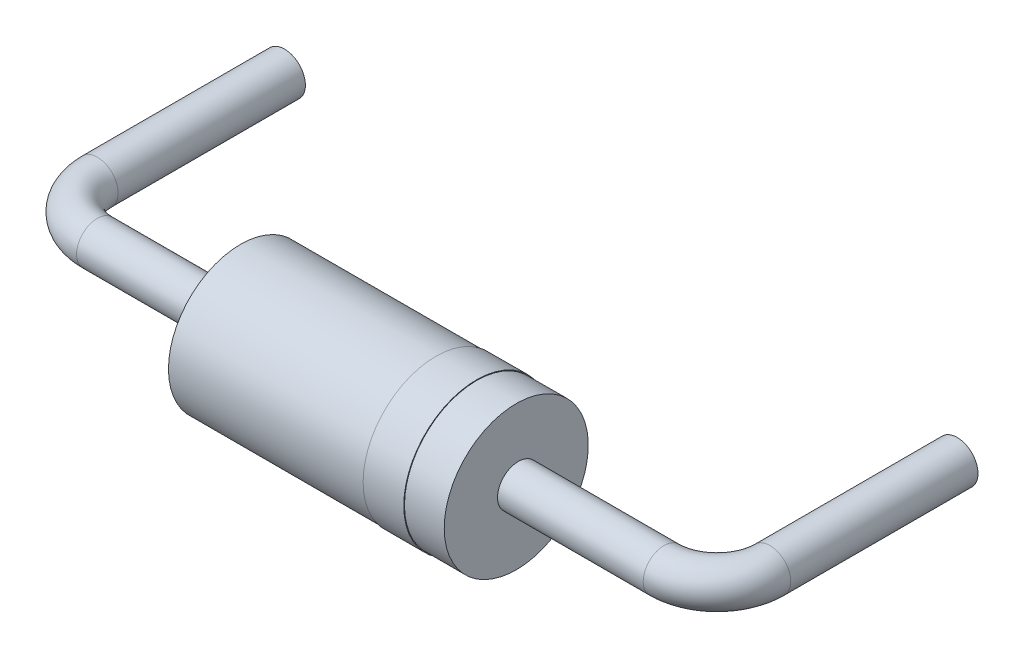
ISO-10303-21;
HEADER;
FILE_DESCRIPTION(('STEP AP214'),'2;1');
FILE_NAME('part.step','',(''),(''),'','','');
FILE_SCHEMA(('AUTOMOTIVE_DESIGN { 1 0 10303 214 1 1 1 1 }'));
ENDSEC;
DATA;
#1=APPLICATION_CONTEXT('core data for automotive mechanical design processes');
#2=APPLICATION_PROTOCOL_DEFINITION('international standard','automotive_design',2000,#1);
#3=PRODUCT_CONTEXT('',#1,'mechanical');
#4=PRODUCT('Part','Part','',(#3));
#5=PRODUCT_RELATED_PRODUCT_CATEGORY('part','',(#4));
#6=PRODUCT_DEFINITION_FORMATION('','',#4);
#7=PRODUCT_DEFINITION_CONTEXT('part definition',#1,'design');
#8=PRODUCT_DEFINITION('design','',#6,#7);
#9=PRODUCT_DEFINITION_SHAPE('','',#8);
#10=(LENGTH_UNIT() NAMED_UNIT(*) SI_UNIT(.MILLI.,.METRE.));
#11=(NAMED_UNIT(*) PLANE_ANGLE_UNIT() SI_UNIT($,.RADIAN.));
#12=(NAMED_UNIT(*) SI_UNIT($,.STERADIAN.) SOLID_ANGLE_UNIT());
#13=UNCERTAINTY_MEASURE_WITH_UNIT(LENGTH_MEASURE(1.E-05),#10,'distance_accuracy_value','');
#14=(GEOMETRIC_REPRESENTATION_CONTEXT(3) GLOBAL_UNCERTAINTY_ASSIGNED_CONTEXT((#13)) GLOBAL_UNIT_ASSIGNED_CONTEXT((#10,
#11,#12)) REPRESENTATION_CONTEXT('',''));
#15=CARTESIAN_POINT('',(0.,0.,0.));
#16=DIRECTION('',(0.,0.,1.));
#17=DIRECTION('',(1.,0.,0.));
#18=AXIS2_PLACEMENT_3D('',#15,#16,#17);
#19=CARTESIAN_POINT('',(46.2577130474384,27.99199126,0.3727));
#20=DIRECTION('',(0.,-1.,0.));
#21=DIRECTION('',(0.,0.,1.));
#22=AXIS2_PLACEMENT_3D('',#19,#20,#21);
#23=TOROIDAL_SURFACE('',#22,1.,0.3935);
#24=CARTESIAN_POINT('',(47.2577130474384,27.99199126,0.3727));
#25=DIRECTION('',(0.,0.,-1.));
#26=DIRECTION('',(1.,0.,0.));
#27=AXIS2_PLACEMENT_3D('',#24,#25,#26);
#28=CIRCLE('',#27,0.3935);
#29=CARTESIAN_POINT('',(46.8642130474384,27.99199126,0.3727));
#30=VERTEX_POINT('',#29);
#31=EDGE_CURVE('E40',#30,#30,#28,.T.);
#32=ORIENTED_EDGE('',*,*,#31,.F.);
#33=EDGE_LOOP('',(#32));
#34=FACE_BOUND('',#33,.T.);
#35=CARTESIAN_POINT('',(46.2577130474384,27.99199126,1.3727));
#36=DIRECTION('',(1.,0.,0.));
#37=DIRECTION('',(0.,0.,1.));
#38=AXIS2_PLACEMENT_3D('',#35,#36,#37);
#39=CIRCLE('',#38,0.3935);
#40=CARTESIAN_POINT('',(46.2577130474384,27.99199126,0.9792));
#41=VERTEX_POINT('',#40);
#42=EDGE_CURVE('E11',#41,#41,#39,.T.);
#43=ORIENTED_EDGE('',*,*,#42,.T.);
#44=EDGE_LOOP('',(#43));
#45=FACE_BOUND('',#44,.T.);
#46=ADVANCED_FACE('F16',(#34,#45),#23,.T.);
#47=CARTESIAN_POINT('',(35.5577130474384,27.99199126,0.3727));
#48=DIRECTION('',(0.,1.,0.));
#49=DIRECTION('',(0.,0.,-1.));
#50=AXIS2_PLACEMENT_3D('',#47,#48,#49);
#51=TOROIDAL_SURFACE('',#50,1.,0.3935);
#52=CARTESIAN_POINT('',(34.5577130474384,27.99199126,0.3727));
#53=DIRECTION('',(0.,0.,-1.));
#54=DIRECTION('',(1.,0.,0.));
#55=AXIS2_PLACEMENT_3D('',#52,#53,#54);
#56=CIRCLE('',#55,0.3935);
#57=CARTESIAN_POINT('',(34.9512130474384,27.99199126,0.3727));
#58=VERTEX_POINT('',#57);
#59=EDGE_CURVE('E106',#58,#58,#56,.T.);
#60=ORIENTED_EDGE('',*,*,#59,.F.);
#61=EDGE_LOOP('',(#60));
#62=FACE_BOUND('',#61,.T.);
#63=CARTESIAN_POINT('',(35.5577130474384,27.99199126,1.3727));
#64=DIRECTION('',(-1.,0.,0.));
#65=DIRECTION('',(0.,0.,-1.));
#66=AXIS2_PLACEMENT_3D('',#63,#64,#65);
#67=CIRCLE('',#66,0.3935);
#68=CARTESIAN_POINT('',(35.5577130474384,27.99199126,0.9792));
#69=VERTEX_POINT('',#68);
#70=EDGE_CURVE('E27',#69,#69,#67,.T.);
#71=ORIENTED_EDGE('',*,*,#70,.T.);
#72=EDGE_LOOP('',(#71));
#73=FACE_BOUND('',#72,.T.);
#74=ADVANCED_FACE('F174',(#62,#73),#51,.T.);
#75=CARTESIAN_POINT('',(34.5577130474384,27.99199126,0.0127000000000011));
#76=DIRECTION('',(0.,0.,-1.));
#77=DIRECTION('',(1.,0.,0.));
#78=AXIS2_PLACEMENT_3D('',#75,#76,#77);
#79=CYLINDRICAL_SURFACE('',#78,0.3935);
#80=ORIENTED_EDGE('',*,*,#59,.T.);
#81=EDGE_LOOP('',(#80));
#82=FACE_BOUND('',#81,.T.);
#83=CARTESIAN_POINT('',(34.5577130474384,27.99199126,-3.1623));
#84=DIRECTION('',(0.,0.,1.));
#85=DIRECTION('',(1.,0.,0.));
#86=AXIS2_PLACEMENT_3D('',#83,#84,#85);
#87=CIRCLE('',#86,0.3935);
#88=CARTESIAN_POINT('',(34.9512130474384,27.99199126,-3.1623));
#89=VERTEX_POINT('',#88);
#90=EDGE_CURVE('E102',#89,#89,#87,.T.);
#91=ORIENTED_EDGE('',*,*,#90,.T.);
#92=EDGE_LOOP('',(#91));
#93=FACE_BOUND('',#92,.T.);
#94=ADVANCED_FACE('F169',(#82,#93),#79,.T.);
#95=CARTESIAN_POINT('',(47.2577130474384,27.99199126,0.0127000000000011));
#96=DIRECTION('',(0.,0.,-1.));
#97=DIRECTION('',(1.,0.,0.));
#98=AXIS2_PLACEMENT_3D('',#95,#96,#97);
#99=CYLINDRICAL_SURFACE('',#98,0.3935);
#100=ORIENTED_EDGE('',*,*,#31,.T.);
#101=EDGE_LOOP('',(#100));
#102=FACE_BOUND('',#101,.T.);
#103=CARTESIAN_POINT('',(47.2577130474384,27.99199126,-3.1623));
#104=DIRECTION('',(0.,0.,1.));
#105=DIRECTION('',(1.,0.,0.));
#106=AXIS2_PLACEMENT_3D('',#103,#104,#105);
#107=CIRCLE('',#106,0.3935);
#108=CARTESIAN_POINT('',(47.6512130474384,27.99199126,-3.1623));
#109=VERTEX_POINT('',#108);
#110=EDGE_CURVE('E20',#109,#109,#107,.T.);
#111=ORIENTED_EDGE('',*,*,#110,.T.);
#112=EDGE_LOOP('',(#111));
#113=FACE_BOUND('',#112,.T.);
#114=ADVANCED_FACE('F162',(#102,#113),#99,.T.);
#115=CARTESIAN_POINT('',(40.9042130474384,27.99199126,1.4127));
#116=DIRECTION('',(1.,0.,0.));
#117=DIRECTION('',(0.,0.,1.));
#118=AXIS2_PLACEMENT_3D('',#115,#116,#117);
#119=CYLINDRICAL_SURFACE('',#118,1.36);
#120=CARTESIAN_POINT('',(42.7568710881034,27.99199126,1.4127));
#121=DIRECTION('',(1.,0.,0.));
#122=DIRECTION('',(0.,0.,1.));
#123=AXIS2_PLACEMENT_3D('',#120,#121,#122);
#124=CIRCLE('',#123,1.36);
#125=CARTESIAN_POINT('',(42.7568710881034,27.99199126,0.052700000000001));
#126=VERTEX_POINT('',#125);
#127=EDGE_CURVE('E125',#126,#126,#124,.T.);
#128=ORIENTED_EDGE('',*,*,#127,.T.);
#129=EDGE_LOOP('',(#128));
#130=FACE_BOUND('',#129,.T.);
#131=CARTESIAN_POINT('',(43.5077130474384,27.99199126,1.4127));
#132=DIRECTION('',(1.,0.,0.));
#133=DIRECTION('',(0.,0.,1.));
#134=AXIS2_PLACEMENT_3D('',#131,#132,#133);
#135=CIRCLE('',#134,1.36);
#136=CARTESIAN_POINT('',(43.5077130474384,27.99199126,2.7727));
#137=VERTEX_POINT('',#136);
#138=EDGE_CURVE('E123',#137,#137,#135,.T.);
#139=ORIENTED_EDGE('',*,*,#138,.F.);
#140=EDGE_LOOP('',(#139));
#141=FACE_BOUND('',#140,.T.);
#142=ADVANCED_FACE('F160',(#130,#141),#119,.T.);
#143=CARTESIAN_POINT('',(40.9042130474384,27.99199126,1.4127));
#144=DIRECTION('',(1.,0.,0.));
#145=DIRECTION('',(0.,0.,1.));
#146=AXIS2_PLACEMENT_3D('',#143,#144,#145);
#147=CYLINDRICAL_SURFACE('',#146,1.36);
#148=CARTESIAN_POINT('',(38.3007130474384,27.99199126,1.4127));
#149=DIRECTION('',(1.,0.,0.));
#150=DIRECTION('',(0.,0.,1.));
#151=AXIS2_PLACEMENT_3D('',#148,#149,#150);
#152=CIRCLE('',#151,1.36);
#153=CARTESIAN_POINT('',(38.3007130474384,27.99199126,0.052700000000001));
#154=VERTEX_POINT('',#153);
#155=EDGE_CURVE('E117',#154,#154,#152,.T.);
#156=ORIENTED_EDGE('',*,*,#155,.T.);
#157=EDGE_LOOP('',(#156));
#158=FACE_BOUND('',#157,.T.);
#159=CARTESIAN_POINT('',(41.9890986914684,27.99199126,1.4127));
#160=DIRECTION('',(-1.,0.,0.));
#161=DIRECTION('',(0.,0.,1.));
#162=AXIS2_PLACEMENT_3D('',#159,#160,#161);
#163=CIRCLE('',#162,1.36);
#164=CARTESIAN_POINT('',(41.9890986914684,27.99199126,2.7727));
#165=VERTEX_POINT('',#164);
#166=EDGE_CURVE('E135',#165,#165,#163,.T.);
#167=ORIENTED_EDGE('',*,*,#166,.T.);
#168=EDGE_LOOP('',(#167));
#169=FACE_BOUND('',#168,.T.);
#170=ADVANCED_FACE('F18',(#158,#169),#147,.T.);
#171=CARTESIAN_POINT('',(42.3729848897864,27.99199126,1.4127));
#172=DIRECTION('',(1.,0.,0.));
#173=DIRECTION('',(0.,0.,1.));
#174=AXIS2_PLACEMENT_3D('',#171,#172,#173);
#175=CYLINDRICAL_SURFACE('',#174,1.373119036377);
#176=CARTESIAN_POINT('',(41.9890986914684,27.99199126,1.4127));
#177=DIRECTION('',(1.,0.,0.));
#178=DIRECTION('',(0.,0.,1.));
#179=AXIS2_PLACEMENT_3D('',#176,#177,#178);
#180=CIRCLE('',#179,1.373119036377);
#181=CARTESIAN_POINT('',(41.9890986914684,27.99199126,0.0395809636230011));
#182=VERTEX_POINT('',#181);
#183=EDGE_CURVE('E62',#182,#182,#180,.T.);
#184=ORIENTED_EDGE('',*,*,#183,.T.);
#185=EDGE_LOOP('',(#184));
#186=FACE_BOUND('',#185,.T.);
#187=CARTESIAN_POINT('',(42.7568710881034,27.99199126,1.4127));
#188=DIRECTION('',(1.,0.,0.));
#189=DIRECTION('',(0.,0.,1.));
#190=AXIS2_PLACEMENT_3D('',#187,#188,#189);
#191=CIRCLE('',#190,1.373119036377);
#192=CARTESIAN_POINT('',(42.7568710881034,27.99199126,2.785819036377));
#193=VERTEX_POINT('',#192);
#194=EDGE_CURVE('E77',#193,#193,#191,.T.);
#195=ORIENTED_EDGE('',*,*,#194,.F.);
#196=EDGE_LOOP('',(#195));
#197=FACE_BOUND('',#196,.T.);
#198=ADVANCED_FACE('F168',(#186,#197),#175,.T.);
#199=CARTESIAN_POINT('',(46.2577130474384,27.99199126,1.3727));
#200=DIRECTION('',(-1.,0.,0.));
#201=DIRECTION('',(0.,0.,1.));
#202=AXIS2_PLACEMENT_3D('',#199,#200,#201);
#203=CYLINDRICAL_SURFACE('',#202,0.3935);
#204=ORIENTED_EDGE('',*,*,#42,.F.);
#205=EDGE_LOOP('',(#204));
#206=FACE_BOUND('',#205,.T.);
#207=CARTESIAN_POINT('',(43.5077130474384,27.99199126,1.3727));
#208=DIRECTION('',(-1.,0.,0.));
#209=DIRECTION('',(0.,0.,1.));
#210=AXIS2_PLACEMENT_3D('',#207,#208,#209);
#211=CIRCLE('',#210,0.3935);
#212=CARTESIAN_POINT('',(43.5077130474384,27.99199126,1.7662));
#213=VERTEX_POINT('',#212);
#214=EDGE_CURVE('E120',#213,#213,#211,.T.);
#215=ORIENTED_EDGE('',*,*,#214,.F.);
#216=EDGE_LOOP('',(#215));
#217=FACE_BOUND('',#216,.T.);
#218=ADVANCED_FACE('F188',(#206,#217),#203,.T.);
#219=CARTESIAN_POINT('',(35.5577130474384,27.99199126,1.3727));
#220=DIRECTION('',(1.,0.,0.));
#221=DIRECTION('',(0.,0.,-1.));
#222=AXIS2_PLACEMENT_3D('',#219,#220,#221);
#223=CYLINDRICAL_SURFACE('',#222,0.3935);
#224=ORIENTED_EDGE('',*,*,#70,.F.);
#225=EDGE_LOOP('',(#224));
#226=FACE_BOUND('',#225,.T.);
#227=CARTESIAN_POINT('',(38.3007130474384,27.99199126,1.3727));
#228=DIRECTION('',(1.,0.,0.));
#229=DIRECTION('',(0.,0.,-1.));
#230=AXIS2_PLACEMENT_3D('',#227,#228,#229);
#231=CIRCLE('',#230,0.3935);
#232=CARTESIAN_POINT('',(38.3007130474384,27.99199126,0.9792));
#233=VERTEX_POINT('',#232);
#234=EDGE_CURVE('E124',#233,#233,#231,.T.);
#235=ORIENTED_EDGE('',*,*,#234,.F.);
#236=EDGE_LOOP('',(#235));
#237=FACE_BOUND('',#236,.T.);
#238=ADVANCED_FACE('F203',(#226,#237),#223,.T.);
#239=CARTESIAN_POINT('',(42.7568710881034,27.99199126,2.742178349446));
#240=DIRECTION('',(1.,0.,0.));
#241=DIRECTION('',(0.,0.,1.));
#242=AXIS2_PLACEMENT_3D('',#239,#240,#241);
#243=PLANE('',#242);
#244=ORIENTED_EDGE('',*,*,#194,.T.);
#245=EDGE_LOOP('',(#244));
#246=FACE_BOUND('',#245,.T.);
#247=ORIENTED_EDGE('',*,*,#127,.F.);
#248=EDGE_LOOP('',(#247));
#249=FACE_BOUND('',#248,.T.);
#250=ADVANCED_FACE('F205',(#246,#249),#243,.T.);
#251=CARTESIAN_POINT('',(41.9890986914684,27.99199126,2.742178349446));
#252=DIRECTION('',(-1.,0.,0.));
#253=DIRECTION('',(0.,-1.,0.));
#254=AXIS2_PLACEMENT_3D('',#251,#252,#253);
#255=PLANE('',#254);
#256=ORIENTED_EDGE('',*,*,#183,.F.);
#257=EDGE_LOOP('',(#256));
#258=FACE_BOUND('',#257,.T.);
#259=ORIENTED_EDGE('',*,*,#166,.F.);
#260=EDGE_LOOP('',(#259));
#261=FACE_BOUND('',#260,.T.);
#262=ADVANCED_FACE('F208',(#258,#261),#255,.T.);
#263=CARTESIAN_POINT('',(43.5077130474384,27.99199126,2.0927));
#264=DIRECTION('',(1.,0.,0.));
#265=DIRECTION('',(0.,0.,1.));
#266=AXIS2_PLACEMENT_3D('',#263,#264,#265);
#267=PLANE('',#266);
#268=ORIENTED_EDGE('',*,*,#138,.T.);
#269=EDGE_LOOP('',(#268));
#270=FACE_BOUND('',#269,.T.);
#271=ORIENTED_EDGE('',*,*,#214,.T.);
#272=EDGE_LOOP('',(#271));
#273=FACE_BOUND('',#272,.T.);
#274=ADVANCED_FACE('F156',(#270,#273),#267,.T.);
#275=CARTESIAN_POINT('',(38.3007130474384,27.99199126,2.0927));
#276=DIRECTION('',(-1.,0.,0.));
#277=DIRECTION('',(0.,-1.,0.));
#278=AXIS2_PLACEMENT_3D('',#275,#276,#277);
#279=PLANE('',#278);
#280=ORIENTED_EDGE('',*,*,#155,.F.);
#281=EDGE_LOOP('',(#280));
#282=FACE_BOUND('',#281,.T.);
#283=ORIENTED_EDGE('',*,*,#234,.T.);
#284=EDGE_LOOP('',(#283));
#285=FACE_BOUND('',#284,.T.);
#286=ADVANCED_FACE('F185',(#282,#285),#279,.T.);
#287=CARTESIAN_POINT('',(47.2577130474384,27.99199126,-3.1623));
#288=DIRECTION('',(0.,0.,-1.));
#289=DIRECTION('',(0.,1.,0.));
#290=AXIS2_PLACEMENT_3D('',#287,#288,#289);
#291=PLANE('',#290);
#292=ORIENTED_EDGE('',*,*,#110,.F.);
#293=EDGE_LOOP('',(#292));
#294=FACE_BOUND('',#293,.T.);
#295=ADVANCED_FACE('F191',(#294),#291,.T.);
#296=CARTESIAN_POINT('',(34.5577130474384,27.99199126,-3.1623));
#297=DIRECTION('',(0.,0.,-1.));
#298=DIRECTION('',(0.,1.,0.));
#299=AXIS2_PLACEMENT_3D('',#296,#297,#298);
#300=PLANE('',#299);
#301=ORIENTED_EDGE('',*,*,#90,.F.);
#302=EDGE_LOOP('',(#301));
#303=FACE_BOUND('',#302,.T.);
#304=ADVANCED_FACE('F103',(#303),#300,.T.);
#305=CLOSED_SHELL('',(#46,#74,#94,#114,#142,#170,#198,#218,#238,#250,#262,#274,#286,#295,#304));
#306=MANIFOLD_SOLID_BREP('B1',#305);
#307=ADVANCED_BREP_SHAPE_REPRESENTATION('',(#18,#306),#14);
#308=SHAPE_DEFINITION_REPRESENTATION(#9,#307);
ENDSEC;
END-ISO-10303-21;
